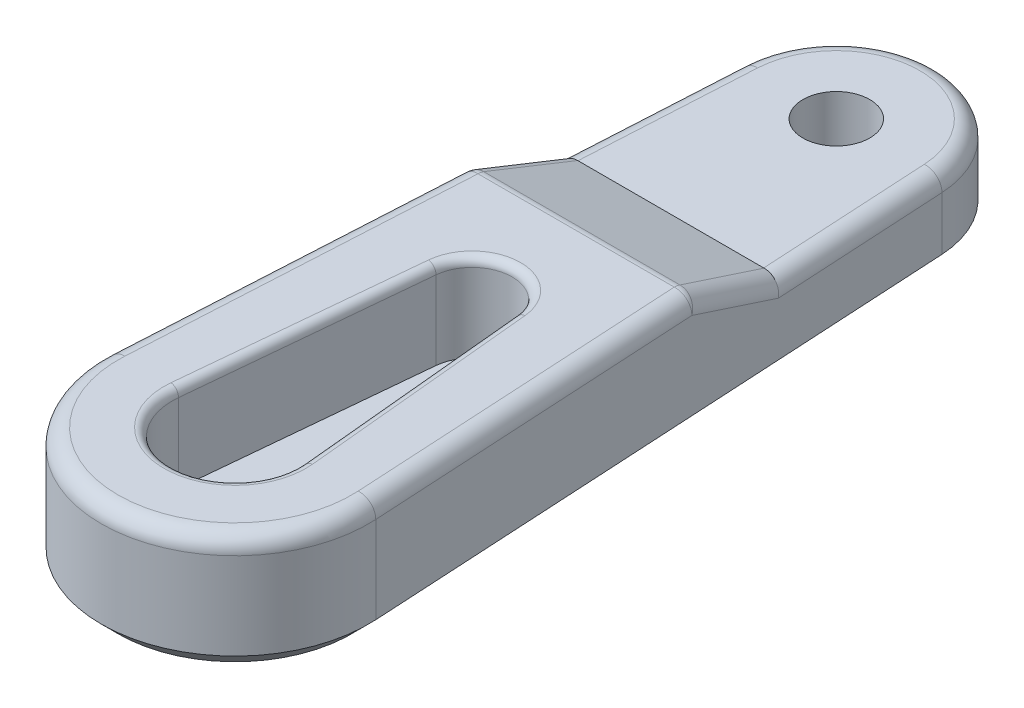
ISO-10303-21;
HEADER;
FILE_DESCRIPTION(('STEP AP214'),'2;1');
FILE_NAME('part.step','',(''),(''),'','','');
FILE_SCHEMA(('AUTOMOTIVE_DESIGN { 1 0 10303 214 1 1 1 1 }'));
ENDSEC;
DATA;
#1=APPLICATION_CONTEXT('core data for automotive mechanical design processes');
#2=APPLICATION_PROTOCOL_DEFINITION('international standard','automotive_design',2000,#1);
#3=PRODUCT_CONTEXT('',#1,'mechanical');
#4=PRODUCT('Part','Part','',(#3));
#5=PRODUCT_RELATED_PRODUCT_CATEGORY('part','',(#4));
#6=PRODUCT_DEFINITION_FORMATION('','',#4);
#7=PRODUCT_DEFINITION_CONTEXT('part definition',#1,'design');
#8=PRODUCT_DEFINITION('design','',#6,#7);
#9=PRODUCT_DEFINITION_SHAPE('','',#8);
#10=(LENGTH_UNIT() NAMED_UNIT(*) SI_UNIT(.MILLI.,.METRE.));
#11=(NAMED_UNIT(*) PLANE_ANGLE_UNIT() SI_UNIT($,.RADIAN.));
#12=(NAMED_UNIT(*) SI_UNIT($,.STERADIAN.) SOLID_ANGLE_UNIT());
#13=UNCERTAINTY_MEASURE_WITH_UNIT(LENGTH_MEASURE(1.E-05),#10,'distance_accuracy_value','');
#14=(GEOMETRIC_REPRESENTATION_CONTEXT(3) GLOBAL_UNCERTAINTY_ASSIGNED_CONTEXT((#13)) GLOBAL_UNIT_ASSIGNED_CONTEXT((#10,
#11,#12)) REPRESENTATION_CONTEXT('',''));
#15=CARTESIAN_POINT('',(0.,0.,0.));
#16=DIRECTION('',(0.,0.,1.));
#17=DIRECTION('',(1.,0.,0.));
#18=AXIS2_PLACEMENT_3D('',#15,#16,#17);
#19=CARTESIAN_POINT('',(0.,5.2,18.));
#20=DIRECTION('',(0.,-1.,0.));
#21=DIRECTION('',(0.,0.,-1.));
#22=AXIS2_PLACEMENT_3D('',#19,#20,#21);
#23=CYLINDRICAL_SURFACE('',#22,2.);
#24=CARTESIAN_POINT('',(0.,0.,18.));
#25=DIRECTION('',(0.,1.,0.));
#26=DIRECTION('',(0.,0.,1.));
#27=AXIS2_PLACEMENT_3D('',#24,#25,#26);
#28=CIRCLE('',#27,2.);
#29=CARTESIAN_POINT('',(0.,0.,20.));
#30=VERTEX_POINT('',#29);
#31=EDGE_CURVE('E228',#30,#30,#28,.T.);
#32=ORIENTED_EDGE('',*,*,#31,.F.);
#33=EDGE_LOOP('',(#32));
#34=FACE_BOUND('',#33,.T.);
#35=CARTESIAN_POINT('',(0.,2.,18.));
#36=DIRECTION('',(0.,1.,0.));
#37=DIRECTION('',(0.,0.,1.));
#38=AXIS2_PLACEMENT_3D('',#35,#36,#37);
#39=CIRCLE('',#38,2.);
#40=CARTESIAN_POINT('',(0.,2.,20.));
#41=VERTEX_POINT('',#40);
#42=EDGE_CURVE('E218',#41,#41,#39,.T.);
#43=ORIENTED_EDGE('',*,*,#42,.T.);
#44=EDGE_LOOP('',(#43));
#45=FACE_BOUND('',#44,.T.);
#46=ADVANCED_FACE('F43',(#34,#45),#23,.F.);
#47=CARTESIAN_POINT('',(0.,5.2,18.));
#48=DIRECTION('',(0.,1.,0.));
#49=DIRECTION('',(0.,0.,1.));
#50=AXIS2_PLACEMENT_3D('',#47,#48,#49);
#51=PLANE('',#50);
#52=DIRECTION('',(1.,0.,0.));
#53=VECTOR('',#52,1.);
#54=CARTESIAN_POINT('',(0.,5.2,-8.09495483890934));
#55=LINE('',#54,#53);
#56=CARTESIAN_POINT('',(-5.55886541217817,5.2,-8.09495483890934));
#57=VERTEX_POINT('',#56);
#58=CARTESIAN_POINT('',(5.55886541217816,5.2,-8.09495483890934));
#59=VERTEX_POINT('',#58);
#60=EDGE_CURVE('E252',#57,#59,#55,.T.);
#61=ORIENTED_EDGE('',*,*,#60,.T.);
#62=DIRECTION('',(-0.0555555555555559,0.,-0.998455597533968));
#63=VECTOR('',#62,1.);
#64=CARTESIAN_POINT('',(4.99227798766983,5.2,-18.2777777777778));
#65=LINE('',#64,#63);
#66=CARTESIAN_POINT('',(4.99227798766984,5.2,-18.2777777777778));
#67=VERTEX_POINT('',#66);
#68=EDGE_CURVE('E265',#59,#67,#65,.T.);
#69=ORIENTED_EDGE('',*,*,#68,.T.);
#70=CARTESIAN_POINT('',(0.,5.2,-18.));
#71=DIRECTION('',(0.,1.,0.));
#72=DIRECTION('',(0.,0.,1.));
#73=AXIS2_PLACEMENT_3D('',#70,#71,#72);
#74=CIRCLE('',#73,5.);
#75=CARTESIAN_POINT('',(-4.99227798766985,5.2,-18.2777777777778));
#76=VERTEX_POINT('',#75);
#77=EDGE_CURVE('E259',#67,#76,#74,.T.);
#78=ORIENTED_EDGE('',*,*,#77,.T.);
#79=DIRECTION('',(-0.0555555555555553,0.,0.998455597533968));
#80=VECTOR('',#79,1.);
#81=CARTESIAN_POINT('',(-5.56195660597858,5.2,-8.0393992833538));
#82=LINE('',#81,#80);
#83=EDGE_CURVE('E262',#76,#57,#82,.T.);
#84=ORIENTED_EDGE('',*,*,#83,.T.);
#85=EDGE_LOOP('',(#61,#69,#78,#84));
#86=FACE_BOUND('',#85,.T.);
#87=CARTESIAN_POINT('',(0.,5.2,-18.));
#88=DIRECTION('',(0.,1.,0.));
#89=DIRECTION('',(0.,0.,1.));
#90=AXIS2_PLACEMENT_3D('',#87,#88,#89);
#91=CIRCLE('',#90,2.);
#92=CARTESIAN_POINT('',(0.,5.2,-16.));
#93=VERTEX_POINT('',#92);
#94=EDGE_CURVE('E224',#93,#93,#91,.T.);
#95=ORIENTED_EDGE('',*,*,#94,.F.);
#96=EDGE_LOOP('',(#95));
#97=FACE_BOUND('',#96,.T.);
#98=ADVANCED_FACE('F467',(#86,#97),#51,.T.);
#99=CARTESIAN_POINT('',(0.,0.,18.));
#100=DIRECTION('',(0.,1.,0.));
#101=DIRECTION('',(0.,0.,1.));
#102=AXIS2_PLACEMENT_3D('',#99,#100,#101);
#103=PLANE('',#102);
#104=CARTESIAN_POINT('',(0.,0.,18.));
#105=DIRECTION('',(0.,1.,0.));
#106=DIRECTION('',(0.,0.,1.));
#107=AXIS2_PLACEMENT_3D('',#104,#105,#106);
#108=CIRCLE('',#107,7.);
#109=CARTESIAN_POINT('',(6.98918918273778,0.,17.6111111111111));
#110=VERTEX_POINT('',#109);
#111=CARTESIAN_POINT('',(-6.98918918273778,0.,17.6111111111111));
#112=VERTEX_POINT('',#111);
#113=EDGE_CURVE('E374',#110,#112,#108,.F.);
#114=ORIENTED_EDGE('',*,*,#113,.T.);
#115=DIRECTION('',(0.0555555555555553,0.,-0.998455597533968));
#116=VECTOR('',#115,1.);
#117=CARTESIAN_POINT('',(-6.98918918273777,0.,17.6111111111111));
#118=LINE('',#117,#116);
#119=CARTESIAN_POINT('',(-4.99227798766985,0.,-18.2777777777778));
#120=VERTEX_POINT('',#119);
#121=EDGE_CURVE('E377',#112,#120,#118,.T.);
#122=ORIENTED_EDGE('',*,*,#121,.T.);
#123=CARTESIAN_POINT('',(0.,0.,-18.));
#124=DIRECTION('',(0.,1.,0.));
#125=DIRECTION('',(0.,0.,1.));
#126=AXIS2_PLACEMENT_3D('',#123,#124,#125);
#127=CIRCLE('',#126,5.);
#128=CARTESIAN_POINT('',(4.99227798766984,0.,-18.2777777777778));
#129=VERTEX_POINT('',#128);
#130=EDGE_CURVE('E371',#120,#129,#127,.F.);
#131=ORIENTED_EDGE('',*,*,#130,.T.);
#132=DIRECTION('',(0.0555555555555559,0.,0.998455597533968));
#133=VECTOR('',#132,1.);
#134=CARTESIAN_POINT('',(6.98918918273778,0.,17.6111111111111));
#135=LINE('',#134,#133);
#136=EDGE_CURVE('E368',#129,#110,#135,.T.);
#137=ORIENTED_EDGE('',*,*,#136,.T.);
#138=EDGE_LOOP('',(#114,#122,#131,#137));
#139=FACE_BOUND('',#138,.T.);
#140=ORIENTED_EDGE('',*,*,#31,.T.);
#141=EDGE_LOOP('',(#140));
#142=FACE_BOUND('',#141,.T.);
#143=CARTESIAN_POINT('',(0.,0.,-18.));
#144=DIRECTION('',(0.,1.,0.));
#145=DIRECTION('',(0.,0.,1.));
#146=AXIS2_PLACEMENT_3D('',#143,#144,#145);
#147=CIRCLE('',#146,2.);
#148=CARTESIAN_POINT('',(0.,0.,-16.));
#149=VERTEX_POINT('',#148);
#150=EDGE_CURVE('E229',#149,#149,#147,.T.);
#151=ORIENTED_EDGE('',*,*,#150,.T.);
#152=EDGE_LOOP('',(#151));
#153=FACE_BOUND('',#152,.T.);
#154=ADVANCED_FACE('F473',(#139,#142,#153),#103,.F.);
#155=CARTESIAN_POINT('',(0.,5.2,18.));
#156=DIRECTION('',(0.,-1.,0.));
#157=DIRECTION('',(0.,0.,-1.));
#158=AXIS2_PLACEMENT_3D('',#155,#156,#157);
#159=CYLINDRICAL_SURFACE('',#158,8.);
#160=DIRECTION('',(0.,-1.,0.));
#161=VECTOR('',#160,1.);
#162=CARTESIAN_POINT('',(-7.98764478027174,5.2,17.5555555555556));
#163=LINE('',#162,#161);
#164=CARTESIAN_POINT('',(-7.98764478027174,6.2,17.5555555555556));
#165=VERTEX_POINT('',#164);
#166=CARTESIAN_POINT('',(-7.98764478027174,1.,17.5555555555556));
#167=VERTEX_POINT('',#166);
#168=EDGE_CURVE('E236',#165,#167,#163,.T.);
#169=ORIENTED_EDGE('',*,*,#168,.T.);
#170=CARTESIAN_POINT('',(0.,1.,18.));
#171=DIRECTION('',(0.,1.,0.));
#172=DIRECTION('',(0.,0.,1.));
#173=AXIS2_PLACEMENT_3D('',#170,#171,#172);
#174=CIRCLE('',#173,8.);
#175=CARTESIAN_POINT('',(7.98764478027175,1.,17.5555555555556));
#176=VERTEX_POINT('',#175);
#177=EDGE_CURVE('E381',#167,#176,#174,.T.);
#178=ORIENTED_EDGE('',*,*,#177,.T.);
#179=DIRECTION('',(0.,-1.,0.));
#180=VECTOR('',#179,1.);
#181=CARTESIAN_POINT('',(7.98764478027175,5.2,17.5555555555556));
#182=LINE('',#181,#180);
#183=CARTESIAN_POINT('',(7.98764478027175,6.2,17.5555555555556));
#184=VERTEX_POINT('',#183);
#185=EDGE_CURVE('E248',#184,#176,#182,.T.);
#186=ORIENTED_EDGE('',*,*,#185,.F.);
#187=CARTESIAN_POINT('',(0.,6.2,18.));
#188=DIRECTION('',(0.,1.,0.));
#189=DIRECTION('',(0.,0.,1.));
#190=AXIS2_PLACEMENT_3D('',#187,#188,#189);
#191=CIRCLE('',#190,8.);
#192=EDGE_CURVE('E301',#184,#165,#191,.F.);
#193=ORIENTED_EDGE('',*,*,#192,.T.);
#194=EDGE_LOOP('',(#169,#178,#186,#193));
#195=FACE_BOUND('',#194,.T.);
#196=ADVANCED_FACE('F484',(#195),#159,.T.);
#197=CARTESIAN_POINT('',(5.99073358520381,5.2,-18.3333333333333));
#198=DIRECTION('',(-0.998455597533968,0.,0.0555555555555559));
#199=DIRECTION('',(0.0555555555555559,0.,0.998455597533968));
#200=AXIS2_PLACEMENT_3D('',#197,#198,#199);
#201=PLANE('',#200);
#202=ORIENTED_EDGE('',*,*,#185,.T.);
#203=DIRECTION('',(-0.0555555555555559,0.,-0.998455597533968));
#204=VECTOR('',#203,1.);
#205=CARTESIAN_POINT('',(5.99073358520381,1.,-18.3333333333333));
#206=LINE('',#205,#204);
#207=CARTESIAN_POINT('',(5.99073358520381,1.,-18.3333333333333));
#208=VERTEX_POINT('',#207);
#209=EDGE_CURVE('E387',#176,#208,#206,.T.);
#210=ORIENTED_EDGE('',*,*,#209,.T.);
#211=DIRECTION('',(0.,-1.,0.));
#212=VECTOR('',#211,1.);
#213=CARTESIAN_POINT('',(5.99073358520381,5.2,-18.3333333333333));
#214=LINE('',#213,#212);
#215=CARTESIAN_POINT('',(5.99073358520381,4.2,-18.3333333333333));
#216=VERTEX_POINT('',#215);
#217=EDGE_CURVE('E244',#216,#208,#214,.T.);
#218=ORIENTED_EDGE('',*,*,#217,.F.);
#219=DIRECTION('',(-0.0555555555555559,0.,-0.998455597533968));
#220=VECTOR('',#219,1.);
#221=CARTESIAN_POINT('',(6.56041220351255,4.2,-8.09495483890935));
#222=LINE('',#221,#220);
#223=CARTESIAN_POINT('',(6.56713210536515,4.2,-7.97418341375644));
#224=VERTEX_POINT('',#223);
#225=EDGE_CURVE('E269',#216,#224,#222,.F.);
#226=ORIENTED_EDGE('',*,*,#225,.T.);
#227=DIRECTION('',(0.0522145722906918,0.341553589824571,0.938410775576692));
#228=VECTOR('',#227,1.);
#229=CARTESIAN_POINT('',(6.07580965103635,0.986089770051911,-16.8043291986932));
#230=LINE('',#229,#228);
#231=CARTESIAN_POINT('',(6.87287957133387,6.2,-2.4792285748471));
#232=VERTEX_POINT('',#231);
#233=EDGE_CURVE('E335',#224,#232,#230,.T.);
#234=ORIENTED_EDGE('',*,*,#233,.T.);
#235=DIRECTION('',(-0.0555555555555559,0.,-0.998455597533968));
#236=VECTOR('',#235,1.);
#237=CARTESIAN_POINT('',(7.98764478027175,6.2,17.5555555555556));
#238=LINE('',#237,#236);
#239=EDGE_CURVE('E298',#232,#184,#238,.F.);
#240=ORIENTED_EDGE('',*,*,#239,.T.);
#241=EDGE_LOOP('',(#202,#210,#218,#226,#234,#240));
#242=FACE_BOUND('',#241,.T.);
#243=ADVANCED_FACE('F493',(#242),#201,.F.);
#244=CARTESIAN_POINT('',(0.,5.2,-18.));
#245=DIRECTION('',(0.,-1.,0.));
#246=DIRECTION('',(0.,0.,-1.));
#247=AXIS2_PLACEMENT_3D('',#244,#245,#246);
#248=CYLINDRICAL_SURFACE('',#247,6.);
#249=ORIENTED_EDGE('',*,*,#217,.T.);
#250=CARTESIAN_POINT('',(0.,1.,-18.));
#251=DIRECTION('',(0.,1.,0.));
#252=DIRECTION('',(0.,0.,1.));
#253=AXIS2_PLACEMENT_3D('',#250,#251,#252);
#254=CIRCLE('',#253,6.);
#255=CARTESIAN_POINT('',(-5.99073358520382,1.,-18.3333333333333));
#256=VERTEX_POINT('',#255);
#257=EDGE_CURVE('E384',#208,#256,#254,.T.);
#258=ORIENTED_EDGE('',*,*,#257,.T.);
#259=DIRECTION('',(0.,-1.,0.));
#260=VECTOR('',#259,1.);
#261=CARTESIAN_POINT('',(-5.99073358520382,5.2,-18.3333333333333));
#262=LINE('',#261,#260);
#263=CARTESIAN_POINT('',(-5.99073358520382,4.2,-18.3333333333333));
#264=VERTEX_POINT('',#263);
#265=EDGE_CURVE('E240',#264,#256,#262,.T.);
#266=ORIENTED_EDGE('',*,*,#265,.F.);
#267=CARTESIAN_POINT('',(0.,4.2,-18.));
#268=DIRECTION('',(0.,1.,0.));
#269=DIRECTION('',(0.,0.,1.));
#270=AXIS2_PLACEMENT_3D('',#267,#268,#269);
#271=CIRCLE('',#270,6.);
#272=EDGE_CURVE('E275',#264,#216,#271,.F.);
#273=ORIENTED_EDGE('',*,*,#272,.T.);
#274=EDGE_LOOP('',(#249,#258,#266,#273));
#275=FACE_BOUND('',#274,.T.);
#276=ADVANCED_FACE('F489',(#275),#248,.T.);
#277=CARTESIAN_POINT('',(-5.99073358520382,5.2,-18.3333333333333));
#278=DIRECTION('',(0.998455597533968,0.,0.0555555555555553));
#279=DIRECTION('',(0.0555555555555553,0.,-0.998455597533968));
#280=AXIS2_PLACEMENT_3D('',#277,#278,#279);
#281=PLANE('',#280);
#282=ORIENTED_EDGE('',*,*,#265,.T.);
#283=DIRECTION('',(-0.0555555555555553,0.,0.998455597533968));
#284=VECTOR('',#283,1.);
#285=CARTESIAN_POINT('',(-5.99073358520382,1.,-18.3333333333333));
#286=LINE('',#285,#284);
#287=EDGE_CURVE('E349',#256,#167,#286,.T.);
#288=ORIENTED_EDGE('',*,*,#287,.T.);
#289=ORIENTED_EDGE('',*,*,#168,.F.);
#290=DIRECTION('',(-0.0555555555555553,0.,0.998455597533968));
#291=VECTOR('',#290,1.);
#292=CARTESIAN_POINT('',(-6.86615966948127,6.2,-2.6));
#293=LINE('',#292,#291);
#294=CARTESIAN_POINT('',(-6.87287957133387,6.2,-2.4792285748471));
#295=VERTEX_POINT('',#294);
#296=EDGE_CURVE('E304',#165,#295,#293,.F.);
#297=ORIENTED_EDGE('',*,*,#296,.T.);
#298=DIRECTION('',(0.0522145722906912,-0.341553589824571,-0.938410775576692));
#299=VECTOR('',#298,1.);
#300=CARTESIAN_POINT('',(-6.07580965103636,0.98608977005191,-16.8043291986932));
#301=LINE('',#300,#299);
#302=CARTESIAN_POINT('',(-6.56713210536515,4.2,-7.97418341375643));
#303=VERTEX_POINT('',#302);
#304=EDGE_CURVE('E338',#295,#303,#301,.T.);
#305=ORIENTED_EDGE('',*,*,#304,.T.);
#306=DIRECTION('',(-0.0555555555555553,0.,0.998455597533968));
#307=VECTOR('',#306,1.);
#308=CARTESIAN_POINT('',(-5.99073358520382,4.2,-18.3333333333333));
#309=LINE('',#308,#307);
#310=EDGE_CURVE('E272',#303,#264,#309,.F.);
#311=ORIENTED_EDGE('',*,*,#310,.T.);
#312=EDGE_LOOP('',(#282,#288,#289,#297,#305,#311));
#313=FACE_BOUND('',#312,.T.);
#314=ADVANCED_FACE('F486',(#313),#281,.F.);
#315=CARTESIAN_POINT('',(0.,5.2,-18.));
#316=DIRECTION('',(0.,-1.,0.));
#317=DIRECTION('',(0.,0.,-1.));
#318=AXIS2_PLACEMENT_3D('',#315,#316,#317);
#319=CYLINDRICAL_SURFACE('',#318,2.);
#320=ORIENTED_EDGE('',*,*,#94,.T.);
#321=EDGE_LOOP('',(#320));
#322=FACE_BOUND('',#321,.T.);
#323=ORIENTED_EDGE('',*,*,#150,.F.);
#324=EDGE_LOOP('',(#323));
#325=FACE_BOUND('',#324,.T.);
#326=ADVANCED_FACE('F479',(#322,#325),#319,.F.);
#327=CARTESIAN_POINT('',(0.,7.2,18.));
#328=DIRECTION('',(0.,1.,0.));
#329=DIRECTION('',(0.,0.,1.));
#330=AXIS2_PLACEMENT_3D('',#327,#328,#329);
#331=PLANE('',#330);
#332=DIRECTION('',(-0.0950704225352113,0.,-0.995470549418202));
#333=VECTOR('',#332,1.);
#334=CARTESIAN_POINT('',(4.23074983502736,7.2,17.5959507042254));
#335=LINE('',#334,#333);
#336=CARTESIAN_POINT('',(2.88686459331278,7.2,3.52429577464789));
#337=VERTEX_POINT('',#336);
#338=CARTESIAN_POINT('',(4.23074983502736,7.2,17.5959507042254));
#339=VERTEX_POINT('',#338);
#340=EDGE_CURVE('E407',#337,#339,#335,.F.);
#341=ORIENTED_EDGE('',*,*,#340,.T.);
#342=CARTESIAN_POINT('',(0.,7.2,18.));
#343=DIRECTION('',(0.,1.,0.));
#344=DIRECTION('',(0.,0.,1.));
#345=AXIS2_PLACEMENT_3D('',#342,#343,#344);
#346=CIRCLE('',#345,4.25);
#347=CARTESIAN_POINT('',(-4.23074983502736,7.2,17.5959507042254));
#348=VERTEX_POINT('',#347);
#349=EDGE_CURVE('E416',#339,#348,#346,.F.);
#350=ORIENTED_EDGE('',*,*,#349,.T.);
#351=DIRECTION('',(-0.0950704225352113,0.,0.995470549418202));
#352=VECTOR('',#351,1.);
#353=CARTESIAN_POINT('',(-2.88686459331278,7.2,3.52429577464788));
#354=LINE('',#353,#352);
#355=CARTESIAN_POINT('',(-2.88686459331278,7.2,3.52429577464789));
#356=VERTEX_POINT('',#355);
#357=EDGE_CURVE('E413',#348,#356,#354,.F.);
#358=ORIENTED_EDGE('',*,*,#357,.T.);
#359=CARTESIAN_POINT('',(0.,7.2,3.8));
#360=DIRECTION('',(0.,1.,0.));
#361=DIRECTION('',(0.,0.,1.));
#362=AXIS2_PLACEMENT_3D('',#359,#360,#361);
#363=CIRCLE('',#362,2.9);
#364=EDGE_CURVE('E410',#356,#337,#363,.F.);
#365=ORIENTED_EDGE('',*,*,#364,.T.);
#366=EDGE_LOOP('',(#341,#350,#358,#365));
#367=FACE_BOUND('',#366,.T.);
#368=DIRECTION('',(-0.0555555555555559,0.,-0.998455597533968));
#369=VECTOR('',#368,1.);
#370=CARTESIAN_POINT('',(5.8677040719473,7.2,-2.54444444444445));
#371=LINE('',#370,#369);
#372=CARTESIAN_POINT('',(6.98918918273778,7.2,17.6111111111111));
#373=VERTEX_POINT('',#372);
#374=CARTESIAN_POINT('',(5.8744239737999,7.2,-2.42367301929154));
#375=VERTEX_POINT('',#374);
#376=EDGE_CURVE('E294',#373,#375,#371,.T.);
#377=ORIENTED_EDGE('',*,*,#376,.T.);
#378=DIRECTION('',(-1.,0.,0.));
#379=VECTOR('',#378,1.);
#380=CARTESIAN_POINT('',(-5.86461287814689,7.2,-2.42367301929154));
#381=LINE('',#380,#379);
#382=CARTESIAN_POINT('',(-5.8744239737999,7.2,-2.42367301929154));
#383=VERTEX_POINT('',#382);
#384=EDGE_CURVE('E320',#375,#383,#381,.T.);
#385=ORIENTED_EDGE('',*,*,#384,.T.);
#386=DIRECTION('',(-0.0555555555555553,0.,0.998455597533968));
#387=VECTOR('',#386,1.);
#388=CARTESIAN_POINT('',(-6.98918918273778,7.2,17.6111111111111));
#389=LINE('',#388,#387);
#390=CARTESIAN_POINT('',(-6.98918918273778,7.2,17.6111111111111));
#391=VERTEX_POINT('',#390);
#392=EDGE_CURVE('E285',#383,#391,#389,.T.);
#393=ORIENTED_EDGE('',*,*,#392,.T.);
#394=CARTESIAN_POINT('',(0.,7.2,18.));
#395=DIRECTION('',(0.,1.,0.));
#396=DIRECTION('',(0.,0.,1.));
#397=AXIS2_PLACEMENT_3D('',#394,#395,#396);
#398=CIRCLE('',#397,7.);
#399=EDGE_CURVE('E291',#391,#373,#398,.T.);
#400=ORIENTED_EDGE('',*,*,#399,.T.);
#401=EDGE_LOOP('',(#377,#385,#393,#400));
#402=FACE_BOUND('',#401,.T.);
#403=ADVANCED_FACE('F446',(#367,#402),#331,.T.);
#404=CARTESIAN_POINT('',(0.,2.,3.8));
#405=DIRECTION('',(0.,1.,0.));
#406=DIRECTION('',(0.,0.,1.));
#407=AXIS2_PLACEMENT_3D('',#404,#405,#406);
#408=CYLINDRICAL_SURFACE('',#407,2.4);
#409=DIRECTION('',(0.,1.,0.));
#410=VECTOR('',#409,1.);
#411=CARTESIAN_POINT('',(2.38912931860368,2.,3.57183098591549));
#412=LINE('',#411,#410);
#413=CARTESIAN_POINT('',(2.38912931860368,2.,3.57183098591549));
#414=VERTEX_POINT('',#413);
#415=CARTESIAN_POINT('',(2.38912931860368,6.7,3.57183098591549));
#416=VERTEX_POINT('',#415);
#417=EDGE_CURVE('E215',#414,#416,#412,.T.);
#418=ORIENTED_EDGE('',*,*,#417,.T.);
#419=CARTESIAN_POINT('',(0.,6.7,3.8));
#420=DIRECTION('',(0.,1.,0.));
#421=DIRECTION('',(0.,0.,1.));
#422=AXIS2_PLACEMENT_3D('',#419,#420,#421);
#423=CIRCLE('',#422,2.4);
#424=CARTESIAN_POINT('',(-2.38912931860368,6.7,3.57183098591549));
#425=VERTEX_POINT('',#424);
#426=EDGE_CURVE('E53',#416,#425,#423,.T.);
#427=ORIENTED_EDGE('',*,*,#426,.T.);
#428=DIRECTION('',(0.,1.,0.));
#429=VECTOR('',#428,1.);
#430=CARTESIAN_POINT('',(-2.38912931860368,2.,3.57183098591549));
#431=LINE('',#430,#429);
#432=CARTESIAN_POINT('',(-2.38912931860368,2.,3.57183098591549));
#433=VERTEX_POINT('',#432);
#434=EDGE_CURVE('E179',#433,#425,#431,.T.);
#435=ORIENTED_EDGE('',*,*,#434,.F.);
#436=CARTESIAN_POINT('',(0.,2.,3.8));
#437=DIRECTION('',(0.,1.,0.));
#438=DIRECTION('',(0.,0.,1.));
#439=AXIS2_PLACEMENT_3D('',#436,#437,#438);
#440=CIRCLE('',#439,2.4);
#441=EDGE_CURVE('E183',#414,#433,#440,.T.);
#442=ORIENTED_EDGE('',*,*,#441,.F.);
#443=EDGE_LOOP('',(#418,#427,#435,#442));
#444=FACE_BOUND('',#443,.T.);
#445=ADVANCED_FACE('F181',(#444),#408,.F.);
#446=CARTESIAN_POINT('',(2.38912931860368,2.,3.57183098591549));
#447=DIRECTION('',(0.995470549418202,0.,-0.0950704225352113));
#448=DIRECTION('',(-0.0950704225352113,0.,-0.995470549418202));
#449=AXIS2_PLACEMENT_3D('',#446,#447,#448);
#450=PLANE('',#449);
#451=DIRECTION('',(0.,1.,0.));
#452=VECTOR('',#451,1.);
#453=CARTESIAN_POINT('',(3.73301456031825,2.,17.643485915493));
#454=LINE('',#453,#452);
#455=CARTESIAN_POINT('',(3.73301456031825,2.,17.643485915493));
#456=VERTEX_POINT('',#455);
#457=CARTESIAN_POINT('',(3.73301456031825,6.7,17.643485915493));
#458=VERTEX_POINT('',#457);
#459=EDGE_CURVE('E219',#456,#458,#454,.T.);
#460=ORIENTED_EDGE('',*,*,#459,.T.);
#461=DIRECTION('',(-0.0950704225352113,0.,-0.995470549418202));
#462=VECTOR('',#461,1.);
#463=CARTESIAN_POINT('',(2.38912931860368,6.7,3.57183098591549));
#464=LINE('',#463,#462);
#465=EDGE_CURVE('E11',#458,#416,#464,.T.);
#466=ORIENTED_EDGE('',*,*,#465,.T.);
#467=ORIENTED_EDGE('',*,*,#417,.F.);
#468=DIRECTION('',(-0.0950704225352113,0.,-0.995470549418202));
#469=VECTOR('',#468,1.);
#470=CARTESIAN_POINT('',(2.38912931860368,2.,3.57183098591549));
#471=LINE('',#470,#469);
#472=EDGE_CURVE('E189',#456,#414,#471,.T.);
#473=ORIENTED_EDGE('',*,*,#472,.F.);
#474=EDGE_LOOP('',(#460,#466,#467,#473));
#475=FACE_BOUND('',#474,.T.);
#476=ADVANCED_FACE('F456',(#475),#450,.F.);
#477=CARTESIAN_POINT('',(0.,2.,18.));
#478=DIRECTION('',(0.,1.,0.));
#479=DIRECTION('',(0.,0.,1.));
#480=AXIS2_PLACEMENT_3D('',#477,#478,#479);
#481=CYLINDRICAL_SURFACE('',#480,3.75);
#482=DIRECTION('',(0.,1.,0.));
#483=VECTOR('',#482,1.);
#484=CARTESIAN_POINT('',(-3.73301456031825,2.,17.643485915493));
#485=LINE('',#484,#483);
#486=CARTESIAN_POINT('',(-3.73301456031825,2.,17.643485915493));
#487=VERTEX_POINT('',#486);
#488=CARTESIAN_POINT('',(-3.73301456031825,6.7,17.643485915493));
#489=VERTEX_POINT('',#488);
#490=EDGE_CURVE('E188',#487,#489,#485,.T.);
#491=ORIENTED_EDGE('',*,*,#490,.T.);
#492=CARTESIAN_POINT('',(0.,6.7,18.));
#493=DIRECTION('',(0.,1.,0.));
#494=DIRECTION('',(0.,0.,1.));
#495=AXIS2_PLACEMENT_3D('',#492,#493,#494);
#496=CIRCLE('',#495,3.75);
#497=EDGE_CURVE('E390',#489,#458,#496,.T.);
#498=ORIENTED_EDGE('',*,*,#497,.T.);
#499=ORIENTED_EDGE('',*,*,#459,.F.);
#500=CARTESIAN_POINT('',(0.,2.,18.));
#501=DIRECTION('',(0.,1.,0.));
#502=DIRECTION('',(0.,0.,1.));
#503=AXIS2_PLACEMENT_3D('',#500,#501,#502);
#504=CIRCLE('',#503,3.75);
#505=EDGE_CURVE('E199',#487,#456,#504,.T.);
#506=ORIENTED_EDGE('',*,*,#505,.F.);
#507=EDGE_LOOP('',(#491,#498,#499,#506));
#508=FACE_BOUND('',#507,.T.);
#509=ADVANCED_FACE('F455',(#508),#481,.F.);
#510=CARTESIAN_POINT('',(-2.38912931860368,2.,3.57183098591549));
#511=DIRECTION('',(-0.995470549418202,0.,-0.0950704225352113));
#512=DIRECTION('',(-0.0950704225352113,0.,0.995470549418202));
#513=AXIS2_PLACEMENT_3D('',#510,#511,#512);
#514=PLANE('',#513);
#515=ORIENTED_EDGE('',*,*,#434,.T.);
#516=DIRECTION('',(-0.0950704225352113,0.,0.995470549418202));
#517=VECTOR('',#516,1.);
#518=CARTESIAN_POINT('',(-3.73301456031826,6.7,17.643485915493));
#519=LINE('',#518,#517);
#520=EDGE_CURVE('E420',#425,#489,#519,.T.);
#521=ORIENTED_EDGE('',*,*,#520,.T.);
#522=ORIENTED_EDGE('',*,*,#490,.F.);
#523=DIRECTION('',(-0.0950704225352113,0.,0.995470549418202));
#524=VECTOR('',#523,1.);
#525=CARTESIAN_POINT('',(-2.38912931860368,2.,3.57183098591549));
#526=LINE('',#525,#524);
#527=EDGE_CURVE('E192',#433,#487,#526,.T.);
#528=ORIENTED_EDGE('',*,*,#527,.F.);
#529=EDGE_LOOP('',(#515,#521,#522,#528));
#530=FACE_BOUND('',#529,.T.);
#531=ADVANCED_FACE('F193',(#530),#514,.F.);
#532=CARTESIAN_POINT('',(0.,2.,3.8));
#533=DIRECTION('',(0.,1.,0.));
#534=DIRECTION('',(0.,0.,1.));
#535=AXIS2_PLACEMENT_3D('',#532,#533,#534);
#536=PLANE('',#535);
#537=ORIENTED_EDGE('',*,*,#42,.F.);
#538=EDGE_LOOP('',(#537));
#539=FACE_BOUND('',#538,.T.);
#540=ORIENTED_EDGE('',*,*,#441,.T.);
#541=ORIENTED_EDGE('',*,*,#527,.T.);
#542=ORIENTED_EDGE('',*,*,#505,.T.);
#543=ORIENTED_EDGE('',*,*,#472,.T.);
#544=EDGE_LOOP('',(#540,#541,#542,#543));
#545=FACE_BOUND('',#544,.T.);
#546=ADVANCED_FACE('F201',(#539,#545),#536,.T.);
#547=CARTESIAN_POINT('',(-6.86615966948127,7.2,-2.6));
#548=DIRECTION('',(0.,-0.93969262078591,0.342020143325663));
#549=DIRECTION('',(-1.,0.,0.));
#550=AXIS2_PLACEMENT_3D('',#547,#548,#549);
#551=PLANE('',#550);
#552=DIRECTION('',(-1.,0.,0.));
#553=VECTOR('',#552,1.);
#554=CARTESIAN_POINT('',(5.86461287814689,7.13969262078591,-2.7656931626172));
#555=LINE('',#554,#553);
#556=CARTESIAN_POINT('',(-5.8744239737999,7.13969262078591,-2.76569316261721));
#557=VERTEX_POINT('',#556);
#558=CARTESIAN_POINT('',(5.8744239737999,7.13969262078591,-2.7656931626172));
#559=VERTEX_POINT('',#558);
#560=EDGE_CURVE('E326',#557,#559,#555,.F.);
#561=ORIENTED_EDGE('',*,*,#560,.T.);
#562=DIRECTION('',(0.0522145722906918,0.341553589824571,0.938410775576692));
#563=VECTOR('',#562,1.);
#564=CARTESIAN_POINT('',(5.84888281503979,6.97261906104804,-3.22472399538491));
#565=LINE('',#564,#563);
#566=CARTESIAN_POINT('',(5.57786832256741,5.19981946244007,-8.09545086177862));
#567=VERTEX_POINT('',#566);
#568=EDGE_CURVE('E329',#559,#567,#565,.F.);
#569=ORIENTED_EDGE('',*,*,#568,.T.);
#570=CARTESIAN_POINT('',(5.4059916791938,4.2,-10.842432258364));
#571=DIRECTION('',(0.,-0.93969262078591,0.342020143325663));
#572=DIRECTION('',(0.0591089046246227,0.341422134834123,0.938049605958761));
#573=AXIS2_PLACEMENT_3D('',#570,#571,#572);
#574=ELLIPSE('',#573,2.92832691547274,1.);
#575=EDGE_CURVE('E278',#567,#59,#574,.T.);
#576=ORIENTED_EDGE('',*,*,#575,.T.);
#577=ORIENTED_EDGE('',*,*,#60,.F.);
#578=CARTESIAN_POINT('',(-5.40599167919381,4.2,-10.842432258364));
#579=DIRECTION('',(0.,-0.93969262078591,0.342020143325663));
#580=DIRECTION('',(0.059108904624622,-0.341422134834123,-0.938049605958761));
#581=AXIS2_PLACEMENT_3D('',#578,#579,#580);
#582=ELLIPSE('',#581,2.92832691547274,1.);
#583=CARTESIAN_POINT('',(-5.57786832256741,5.19981946244007,-8.09545086177862));
#584=VERTEX_POINT('',#583);
#585=EDGE_CURVE('E281',#57,#584,#582,.T.);
#586=ORIENTED_EDGE('',*,*,#585,.T.);
#587=DIRECTION('',(0.0522145722906912,-0.341553589824571,-0.938410775576692));
#588=VECTOR('',#587,1.);
#589=CARTESIAN_POINT('',(-5.88632208260831,7.2175222686668,-2.55185796250034));
#590=LINE('',#589,#588);
#591=EDGE_CURVE('E323',#584,#557,#590,.F.);
#592=ORIENTED_EDGE('',*,*,#591,.T.);
#593=EDGE_LOOP('',(#561,#569,#576,#577,#586,#592));
#594=FACE_BOUND('',#593,.T.);
#595=ADVANCED_FACE('F502',(#594),#551,.F.);
#596=CARTESIAN_POINT('',(-6.98918918273778,4.2,17.6111111111111));
#597=DIRECTION('',(0.0555555555555553,0.,-0.998455597533968));
#598=DIRECTION('',(-0.998455597533968,0.,-0.0555555555555553));
#599=AXIS2_PLACEMENT_3D('',#596,#597,#598);
#600=CYLINDRICAL_SURFACE('',#599,1.);
#601=ORIENTED_EDGE('',*,*,#585,.F.);
#602=ORIENTED_EDGE('',*,*,#83,.F.);
#603=CARTESIAN_POINT('',(-4.99227798766985,4.2,-18.2777777777778));
#604=DIRECTION('',(0.0555555555555552,0.,-0.998455597533968));
#605=DIRECTION('',(-0.998455597533968,0.,-0.0555555555555552));
#606=AXIS2_PLACEMENT_3D('',#603,#604,#605);
#607=CIRCLE('',#606,1.);
#608=EDGE_CURVE('E204',#264,#76,#607,.T.);
#609=ORIENTED_EDGE('',*,*,#608,.F.);
#610=ORIENTED_EDGE('',*,*,#310,.F.);
#611=CARTESIAN_POINT('',(-5.56867650783118,4.19999999999999,-7.91862785820093));
#612=DIRECTION('',(0.0547139348100255,-0.173403717906443,-0.98332982053522));
#613=DIRECTION('',(-0.00963353988369122,-0.984850826580464,0.173135912776889));
#614=AXIS2_PLACEMENT_3D('',#611,#612,#613);
#615=ELLIPSE('',#614,1.01538220105083,1.);
#616=EDGE_CURVE('E346',#303,#584,#615,.T.);
#617=ORIENTED_EDGE('',*,*,#616,.T.);
#618=EDGE_LOOP('',(#601,#602,#609,#610,#617));
#619=FACE_BOUND('',#618,.T.);
#620=ADVANCED_FACE('F508',(#619),#600,.T.);
#621=CARTESIAN_POINT('',(0.,4.2,-18.));
#622=DIRECTION('',(0.,1.,0.));
#623=DIRECTION('',(0.,0.,1.));
#624=AXIS2_PLACEMENT_3D('',#621,#622,#623);
#625=TOROIDAL_SURFACE('',#624,5.,1.);
#626=ORIENTED_EDGE('',*,*,#608,.T.);
#627=ORIENTED_EDGE('',*,*,#77,.F.);
#628=CARTESIAN_POINT('',(4.99227798766984,4.2,-18.2777777777778));
#629=DIRECTION('',(0.0555555555555552,0.,0.998455597533968));
#630=DIRECTION('',(0.998455597533968,0.,-0.0555555555555552));
#631=AXIS2_PLACEMENT_3D('',#628,#629,#630);
#632=CIRCLE('',#631,1.);
#633=EDGE_CURVE('E208',#216,#67,#632,.T.);
#634=ORIENTED_EDGE('',*,*,#633,.F.);
#635=ORIENTED_EDGE('',*,*,#272,.F.);
#636=EDGE_LOOP('',(#626,#627,#634,#635));
#637=FACE_BOUND('',#636,.T.);
#638=ADVANCED_FACE('F514',(#637),#625,.T.);
#639=CARTESIAN_POINT('',(6.98918918273778,4.2,17.6111111111111));
#640=DIRECTION('',(0.0555555555555559,0.,0.998455597533968));
#641=DIRECTION('',(0.998455597533968,0.,-0.0555555555555559));
#642=AXIS2_PLACEMENT_3D('',#639,#640,#641);
#643=CYLINDRICAL_SURFACE('',#642,1.);
#644=ORIENTED_EDGE('',*,*,#575,.F.);
#645=CARTESIAN_POINT('',(5.56867650783117,4.19999999999998,-7.918627858201));
#646=DIRECTION('',(0.0547139348100261,0.173403717906443,0.98332982053522));
#647=DIRECTION('',(-0.00963353988369132,0.984850826580464,-0.173135912776889));
#648=AXIS2_PLACEMENT_3D('',#645,#646,#647);
#649=ELLIPSE('',#648,1.01538220105083,1.);
#650=EDGE_CURVE('E342',#567,#224,#649,.F.);
#651=ORIENTED_EDGE('',*,*,#650,.T.);
#652=ORIENTED_EDGE('',*,*,#225,.F.);
#653=ORIENTED_EDGE('',*,*,#633,.T.);
#654=ORIENTED_EDGE('',*,*,#68,.F.);
#655=EDGE_LOOP('',(#644,#651,#652,#653,#654));
#656=FACE_BOUND('',#655,.T.);
#657=ADVANCED_FACE('F510',(#656),#643,.T.);
#658=CARTESIAN_POINT('',(-6.98918918273778,6.2,17.6111111111111));
#659=DIRECTION('',(0.0555555555555553,0.,-0.998455597533968));
#660=DIRECTION('',(-0.998455597533968,0.,-0.0555555555555553));
#661=AXIS2_PLACEMENT_3D('',#658,#659,#660);
#662=CYLINDRICAL_SURFACE('',#661,1.);
#663=ORIENTED_EDGE('',*,*,#392,.F.);
#664=CARTESIAN_POINT('',(-5.8744239737999,6.2,-2.42367301929154));
#665=DIRECTION('',(0.0555555555555553,0.,-0.998455597533968));
#666=DIRECTION('',(-0.998455597533968,0.,-0.0555555555555553));
#667=AXIS2_PLACEMENT_3D('',#664,#665,#666);
#668=CIRCLE('',#667,1.);
#669=EDGE_CURVE('E332',#383,#295,#668,.F.);
#670=ORIENTED_EDGE('',*,*,#669,.T.);
#671=ORIENTED_EDGE('',*,*,#296,.F.);
#672=CARTESIAN_POINT('',(-6.98918918273778,6.2,17.6111111111111));
#673=DIRECTION('',(-0.0555555555555552,0.,0.998455597533968));
#674=DIRECTION('',(0.998455597533968,0.,0.0555555555555552));
#675=AXIS2_PLACEMENT_3D('',#672,#673,#674);
#676=CIRCLE('',#675,1.);
#677=EDGE_CURVE('E287',#391,#165,#676,.T.);
#678=ORIENTED_EDGE('',*,*,#677,.F.);
#679=EDGE_LOOP('',(#663,#670,#671,#678));
#680=FACE_BOUND('',#679,.T.);
#681=ADVANCED_FACE('F513',(#680),#662,.T.);
#682=CARTESIAN_POINT('',(0.,6.2,18.));
#683=DIRECTION('',(0.,1.,0.));
#684=DIRECTION('',(0.,0.,1.));
#685=AXIS2_PLACEMENT_3D('',#682,#683,#684);
#686=TOROIDAL_SURFACE('',#685,7.,1.);
#687=ORIENTED_EDGE('',*,*,#677,.T.);
#688=ORIENTED_EDGE('',*,*,#192,.F.);
#689=CARTESIAN_POINT('',(6.98918918273778,6.2,17.6111111111111));
#690=DIRECTION('',(-0.0555555555555551,0.,-0.998455597533968));
#691=DIRECTION('',(-0.998455597533968,0.,0.0555555555555552));
#692=AXIS2_PLACEMENT_3D('',#689,#690,#691);
#693=CIRCLE('',#692,1.);
#694=EDGE_CURVE('E309',#373,#184,#693,.T.);
#695=ORIENTED_EDGE('',*,*,#694,.F.);
#696=ORIENTED_EDGE('',*,*,#399,.F.);
#697=EDGE_LOOP('',(#687,#688,#695,#696));
#698=FACE_BOUND('',#697,.T.);
#699=ADVANCED_FACE('F526',(#698),#686,.T.);
#700=CARTESIAN_POINT('',(6.98918918273778,6.2,17.6111111111111));
#701=DIRECTION('',(0.0555555555555559,0.,0.998455597533968));
#702=DIRECTION('',(0.998455597533968,0.,-0.0555555555555559));
#703=AXIS2_PLACEMENT_3D('',#700,#701,#702);
#704=CYLINDRICAL_SURFACE('',#703,1.);
#705=ORIENTED_EDGE('',*,*,#239,.F.);
#706=CARTESIAN_POINT('',(5.8744239737999,6.2,-2.42367301929154));
#707=DIRECTION('',(0.0555555555555559,0.,0.998455597533968));
#708=DIRECTION('',(0.998455597533968,0.,-0.0555555555555559));
#709=AXIS2_PLACEMENT_3D('',#706,#707,#708);
#710=CIRCLE('',#709,1.);
#711=EDGE_CURVE('E308',#232,#375,#710,.T.);
#712=ORIENTED_EDGE('',*,*,#711,.T.);
#713=ORIENTED_EDGE('',*,*,#376,.F.);
#714=ORIENTED_EDGE('',*,*,#694,.T.);
#715=EDGE_LOOP('',(#705,#712,#713,#714));
#716=FACE_BOUND('',#715,.T.);
#717=ADVANCED_FACE('F522',(#716),#704,.T.);
#718=CARTESIAN_POINT('',(-5.0773540535024,0.98608977005191,-16.7487736431376));
#719=DIRECTION('',(0.0522145722906912,-0.341553589824571,-0.938410775576692));
#720=DIRECTION('',(0.,0.93969262078591,-0.342020143325663));
#721=AXIS2_PLACEMENT_3D('',#718,#719,#720);
#722=CYLINDRICAL_SURFACE('',#721,1.);
#723=ORIENTED_EDGE('',*,*,#616,.F.);
#724=ORIENTED_EDGE('',*,*,#304,.F.);
#725=CARTESIAN_POINT('',(-5.8744239737999,6.2,-2.42367301929154));
#726=DIRECTION('',(-0.052214572290691,0.341553589824571,0.938410775576692));
#727=DIRECTION('',(0.,-0.93969262078591,0.342020143325664));
#728=AXIS2_PLACEMENT_3D('',#725,#726,#727);
#729=CIRCLE('',#728,1.);
#730=EDGE_CURVE('E313',#557,#295,#729,.T.);
#731=ORIENTED_EDGE('',*,*,#730,.F.);
#732=ORIENTED_EDGE('',*,*,#591,.F.);
#733=EDGE_LOOP('',(#723,#724,#731,#732));
#734=FACE_BOUND('',#733,.T.);
#735=ADVANCED_FACE('F525',(#734),#722,.T.);
#736=CARTESIAN_POINT('',(-5.8744239737999,6.2,-2.42367301929154));
#737=DIRECTION('',(0.,-0.93969262078591,0.342020143325663));
#738=DIRECTION('',(0.,-0.342020143325663,-0.93969262078591));
#739=AXIS2_PLACEMENT_3D('',#736,#737,#738);
#740=SPHERICAL_SURFACE('',#739,1.);
#741=ORIENTED_EDGE('',*,*,#730,.T.);
#742=ORIENTED_EDGE('',*,*,#669,.F.);
#743=CARTESIAN_POINT('',(-5.8744239737999,6.2,-2.42367301929154));
#744=DIRECTION('',(1.,0.,0.));
#745=DIRECTION('',(0.,0.,-1.));
#746=AXIS2_PLACEMENT_3D('',#743,#744,#745);
#747=CIRCLE('',#746,1.);
#748=EDGE_CURVE('E358',#557,#383,#747,.T.);
#749=ORIENTED_EDGE('',*,*,#748,.F.);
#750=EDGE_LOOP('',(#741,#742,#749));
#751=FACE_BOUND('',#750,.T.);
#752=ADVANCED_FACE('F546',(#751),#740,.T.);
#753=CARTESIAN_POINT('',(0.,6.2,-2.42367301929154));
#754=DIRECTION('',(1.,0.,0.));
#755=DIRECTION('',(0.,0.,-1.));
#756=AXIS2_PLACEMENT_3D('',#753,#754,#755);
#757=CYLINDRICAL_SURFACE('',#756,1.);
#758=ORIENTED_EDGE('',*,*,#748,.T.);
#759=ORIENTED_EDGE('',*,*,#384,.F.);
#760=CARTESIAN_POINT('',(5.8744239737999,6.2,-2.42367301929154));
#761=DIRECTION('',(1.,0.,0.));
#762=DIRECTION('',(0.,0.,-1.));
#763=AXIS2_PLACEMENT_3D('',#760,#761,#762);
#764=CIRCLE('',#763,1.);
#765=EDGE_CURVE('E354',#559,#375,#764,.T.);
#766=ORIENTED_EDGE('',*,*,#765,.F.);
#767=ORIENTED_EDGE('',*,*,#560,.F.);
#768=EDGE_LOOP('',(#758,#759,#766,#767));
#769=FACE_BOUND('',#768,.T.);
#770=ADVANCED_FACE('F542',(#769),#757,.T.);
#771=CARTESIAN_POINT('',(5.07735405350238,0.986089770051909,-16.7487736431376));
#772=DIRECTION('',(0.0522145722906917,0.341553589824571,0.938410775576692));
#773=DIRECTION('',(0.,-0.93969262078591,0.342020143325663));
#774=AXIS2_PLACEMENT_3D('',#771,#772,#773);
#775=CYLINDRICAL_SURFACE('',#774,1.);
#776=ORIENTED_EDGE('',*,*,#650,.F.);
#777=ORIENTED_EDGE('',*,*,#568,.F.);
#778=CARTESIAN_POINT('',(5.8744239737999,6.2,-2.42367301929154));
#779=DIRECTION('',(0.0522145722906919,0.341553589824572,0.938410775576692));
#780=DIRECTION('',(0.,-0.93969262078591,0.342020143325664));
#781=AXIS2_PLACEMENT_3D('',#778,#779,#780);
#782=CIRCLE('',#781,1.);
#783=EDGE_CURVE('E350',#232,#559,#782,.T.);
#784=ORIENTED_EDGE('',*,*,#783,.F.);
#785=ORIENTED_EDGE('',*,*,#233,.F.);
#786=EDGE_LOOP('',(#776,#777,#784,#785));
#787=FACE_BOUND('',#786,.T.);
#788=ADVANCED_FACE('F538',(#787),#775,.T.);
#789=CARTESIAN_POINT('',(5.8744239737999,6.2,-2.42367301929154));
#790=DIRECTION('',(0.,-0.93969262078591,0.342020143325663));
#791=DIRECTION('',(0.,-0.342020143325663,-0.93969262078591));
#792=AXIS2_PLACEMENT_3D('',#789,#790,#791);
#793=SPHERICAL_SURFACE('',#792,1.);
#794=ORIENTED_EDGE('',*,*,#765,.T.);
#795=ORIENTED_EDGE('',*,*,#711,.F.);
#796=ORIENTED_EDGE('',*,*,#783,.T.);
#797=EDGE_LOOP('',(#794,#795,#796));
#798=FACE_BOUND('',#797,.T.);
#799=ADVANCED_FACE('F534',(#798),#793,.T.);
#800=CARTESIAN_POINT('',(5.99073358520381,1.,-18.3333333333333));
#801=DIRECTION('',(-0.706014723729935,0.707106781186548,0.0392837100659195));
#802=DIRECTION('',(-0.0555555555555559,0.,-0.998455597533968));
#803=AXIS2_PLACEMENT_3D('',#800,#801,#802);
#804=PLANE('',#803);
#805=DIRECTION('',(0.706014723729935,0.707106781186548,-0.039283710065919));
#806=VECTOR('',#805,1.);
#807=CARTESIAN_POINT('',(6.98918918273778,0.,17.6111111111111));
#808=LINE('',#807,#806);
#809=EDGE_CURVE('E397',#110,#176,#808,.T.);
#810=ORIENTED_EDGE('',*,*,#809,.F.);
#811=ORIENTED_EDGE('',*,*,#136,.F.);
#812=DIRECTION('',(-0.706014723729935,-0.707106781186548,0.039283710065919));
#813=VECTOR('',#812,1.);
#814=CARTESIAN_POINT('',(5.99073358520381,1.,-18.3333333333333));
#815=LINE('',#814,#813);
#816=EDGE_CURVE('E355',#208,#129,#815,.T.);
#817=ORIENTED_EDGE('',*,*,#816,.F.);
#818=ORIENTED_EDGE('',*,*,#209,.F.);
#819=EDGE_LOOP('',(#810,#811,#817,#818));
#820=FACE_BOUND('',#819,.T.);
#821=ADVANCED_FACE('F537',(#820),#804,.F.);
#822=CARTESIAN_POINT('',(0.,1.,-18.));
#823=DIRECTION('',(0.,1.,0.));
#824=DIRECTION('',(0.,0.,1.));
#825=AXIS2_PLACEMENT_3D('',#822,#823,#824);
#826=CONICAL_SURFACE('',#825,6.,0.785398163397448);
#827=ORIENTED_EDGE('',*,*,#816,.T.);
#828=ORIENTED_EDGE('',*,*,#130,.F.);
#829=DIRECTION('',(0.706014723729935,-0.707106781186548,0.039283710065919));
#830=VECTOR('',#829,1.);
#831=CARTESIAN_POINT('',(-5.99073358520382,1.,-18.3333333333333));
#832=LINE('',#831,#830);
#833=EDGE_CURVE('E394',#256,#120,#832,.T.);
#834=ORIENTED_EDGE('',*,*,#833,.F.);
#835=ORIENTED_EDGE('',*,*,#257,.F.);
#836=EDGE_LOOP('',(#827,#828,#834,#835));
#837=FACE_BOUND('',#836,.T.);
#838=ADVANCED_FACE('F568',(#837),#826,.T.);
#839=CARTESIAN_POINT('',(0.,1.,18.));
#840=DIRECTION('',(0.,1.,0.));
#841=DIRECTION('',(0.,0.,1.));
#842=AXIS2_PLACEMENT_3D('',#839,#840,#841);
#843=CONICAL_SURFACE('',#842,8.,0.785398163397448);
#844=ORIENTED_EDGE('',*,*,#809,.T.);
#845=ORIENTED_EDGE('',*,*,#177,.F.);
#846=DIRECTION('',(-0.706014723729936,0.707106781186547,-0.039283710065919));
#847=VECTOR('',#846,1.);
#848=CARTESIAN_POINT('',(-6.98918918273778,0.,17.6111111111111));
#849=LINE('',#848,#847);
#850=EDGE_CURVE('E391',#112,#167,#849,.T.);
#851=ORIENTED_EDGE('',*,*,#850,.F.);
#852=ORIENTED_EDGE('',*,*,#113,.F.);
#853=EDGE_LOOP('',(#844,#845,#851,#852));
#854=FACE_BOUND('',#853,.T.);
#855=ADVANCED_FACE('F561',(#854),#843,.T.);
#856=CARTESIAN_POINT('',(-5.99073358520382,1.,-18.3333333333333));
#857=DIRECTION('',(0.706014723729935,0.707106781186548,0.0392837100659191));
#858=DIRECTION('',(-0.0555555555555553,0.,0.998455597533968));
#859=AXIS2_PLACEMENT_3D('',#856,#857,#858);
#860=PLANE('',#859);
#861=ORIENTED_EDGE('',*,*,#833,.T.);
#862=ORIENTED_EDGE('',*,*,#121,.F.);
#863=ORIENTED_EDGE('',*,*,#850,.T.);
#864=ORIENTED_EDGE('',*,*,#287,.F.);
#865=EDGE_LOOP('',(#861,#862,#863,#864));
#866=FACE_BOUND('',#865,.T.);
#867=ADVANCED_FACE('F555',(#866),#860,.F.);
#868=CARTESIAN_POINT('',(0.,6.7,3.8));
#869=DIRECTION('',(0.,1.,0.));
#870=DIRECTION('',(0.,0.,1.));
#871=AXIS2_PLACEMENT_3D('',#868,#869,#870);
#872=TOROIDAL_SURFACE('',#871,2.9,0.5);
#873=CARTESIAN_POINT('',(2.88686459331278,6.7,3.52429577464789));
#874=DIRECTION('',(0.0950704225352115,0.,0.995470549418202));
#875=DIRECTION('',(0.995470549418202,0.,-0.0950704225352116));
#876=AXIS2_PLACEMENT_3D('',#873,#874,#875);
#877=CIRCLE('',#876,0.5);
#878=EDGE_CURVE('E430',#337,#416,#877,.T.);
#879=ORIENTED_EDGE('',*,*,#878,.F.);
#880=ORIENTED_EDGE('',*,*,#364,.F.);
#881=CARTESIAN_POINT('',(-2.88686459331278,6.7,3.52429577464789));
#882=DIRECTION('',(-0.0950704225352108,0.,0.995470549418202));
#883=DIRECTION('',(0.995470549418202,0.,0.0950704225352108));
#884=AXIS2_PLACEMENT_3D('',#881,#882,#883);
#885=CIRCLE('',#884,0.5);
#886=EDGE_CURVE('E47',#425,#356,#885,.T.);
#887=ORIENTED_EDGE('',*,*,#886,.F.);
#888=ORIENTED_EDGE('',*,*,#426,.F.);
#889=EDGE_LOOP('',(#879,#880,#887,#888));
#890=FACE_BOUND('',#889,.T.);
#891=ADVANCED_FACE('F45',(#890),#872,.T.);
#892=CARTESIAN_POINT('',(-2.88686459331278,6.7,3.52429577464789));
#893=DIRECTION('',(0.0950704225352113,0.,-0.995470549418202));
#894=DIRECTION('',(-0.995470549418202,0.,-0.0950704225352113));
#895=AXIS2_PLACEMENT_3D('',#892,#893,#894);
#896=CYLINDRICAL_SURFACE('',#895,0.5);
#897=ORIENTED_EDGE('',*,*,#886,.T.);
#898=ORIENTED_EDGE('',*,*,#357,.F.);
#899=CARTESIAN_POINT('',(-4.23074983502736,6.7,17.5959507042254));
#900=DIRECTION('',(-0.0950704225352108,0.,0.995470549418202));
#901=DIRECTION('',(0.995470549418202,0.,0.0950704225352108));
#902=AXIS2_PLACEMENT_3D('',#899,#900,#901);
#903=CIRCLE('',#902,0.5);
#904=EDGE_CURVE('E428',#489,#348,#903,.T.);
#905=ORIENTED_EDGE('',*,*,#904,.F.);
#906=ORIENTED_EDGE('',*,*,#520,.F.);
#907=EDGE_LOOP('',(#897,#898,#905,#906));
#908=FACE_BOUND('',#907,.T.);
#909=ADVANCED_FACE('F441',(#908),#896,.T.);
#910=CARTESIAN_POINT('',(2.88686459331278,6.7,3.52429577464789));
#911=DIRECTION('',(0.0950704225352113,0.,0.995470549418202));
#912=DIRECTION('',(0.995470549418202,0.,-0.0950704225352113));
#913=AXIS2_PLACEMENT_3D('',#910,#911,#912);
#914=CYLINDRICAL_SURFACE('',#913,0.5);
#915=ORIENTED_EDGE('',*,*,#878,.T.);
#916=ORIENTED_EDGE('',*,*,#465,.F.);
#917=CARTESIAN_POINT('',(4.23074983502736,6.7,17.5959507042254));
#918=DIRECTION('',(0.0950704225352108,0.,0.995470549418202));
#919=DIRECTION('',(0.995470549418202,0.,-0.0950704225352108));
#920=AXIS2_PLACEMENT_3D('',#917,#918,#919);
#921=CIRCLE('',#920,0.5);
#922=EDGE_CURVE('E425',#339,#458,#921,.T.);
#923=ORIENTED_EDGE('',*,*,#922,.F.);
#924=ORIENTED_EDGE('',*,*,#340,.F.);
#925=EDGE_LOOP('',(#915,#916,#923,#924));
#926=FACE_BOUND('',#925,.T.);
#927=ADVANCED_FACE('F453',(#926),#914,.T.);
#928=CARTESIAN_POINT('',(0.,6.7,18.));
#929=DIRECTION('',(0.,1.,0.));
#930=DIRECTION('',(0.,0.,1.));
#931=AXIS2_PLACEMENT_3D('',#928,#929,#930);
#932=TOROIDAL_SURFACE('',#931,4.25,0.5);
#933=ORIENTED_EDGE('',*,*,#904,.T.);
#934=ORIENTED_EDGE('',*,*,#349,.F.);
#935=ORIENTED_EDGE('',*,*,#922,.T.);
#936=ORIENTED_EDGE('',*,*,#497,.F.);
#937=EDGE_LOOP('',(#933,#934,#935,#936));
#938=FACE_BOUND('',#937,.T.);
#939=ADVANCED_FACE('F451',(#938),#932,.T.);
#940=CLOSED_SHELL('',(#46,#98,#154,#196,#243,#276,#314,#326,#403,#445,#476,#509,#531,#546,#595,
#620,#638,#657,#681,#699,#717,#735,#752,#770,#788,#799,#821,#838,#855,#867,#891,#909,#927,#939));
#941=MANIFOLD_SOLID_BREP('B2',#940);
#942=ADVANCED_BREP_SHAPE_REPRESENTATION('',(#18,#941),#14);
#943=SHAPE_DEFINITION_REPRESENTATION(#9,#942);
ENDSEC;
END-ISO-10303-21;
